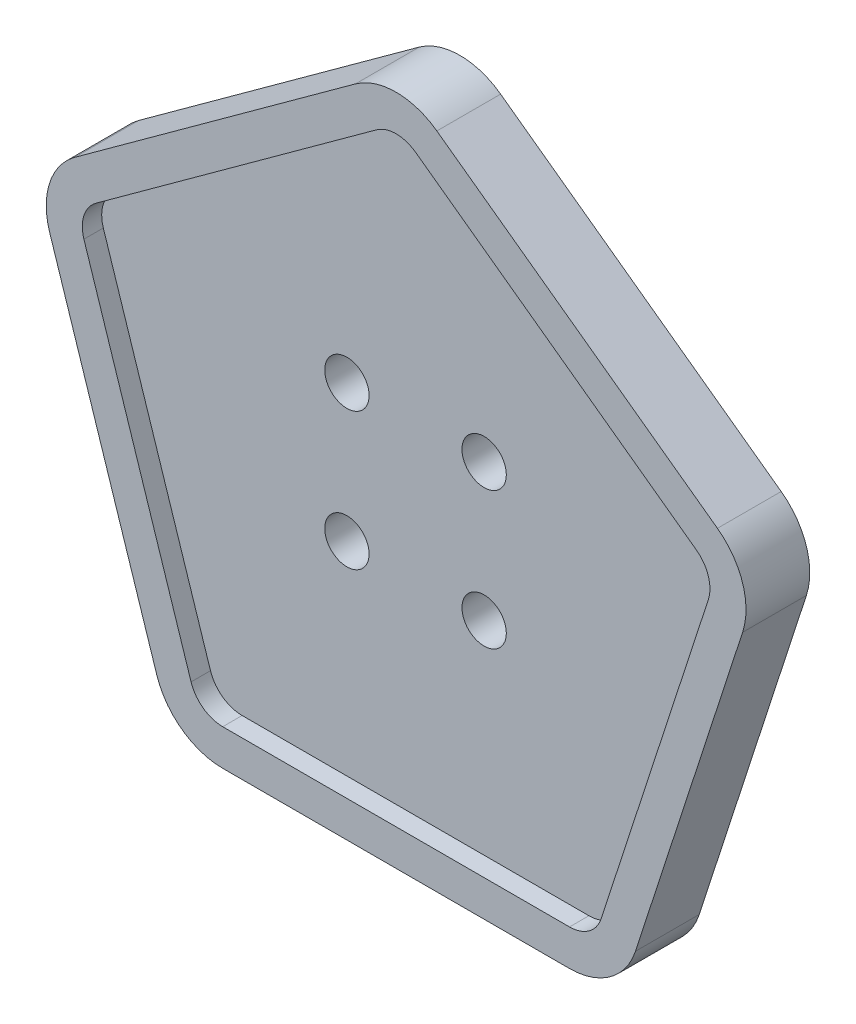
ISO-10303-21;
HEADER;
FILE_DESCRIPTION(('STEP AP214'),'2;1');
FILE_NAME('part.step','',(''),(''),'','','');
FILE_SCHEMA(('AUTOMOTIVE_DESIGN { 1 0 10303 214 1 1 1 1 }'));
ENDSEC;
DATA;
#1=APPLICATION_CONTEXT('core data for automotive mechanical design processes');
#2=APPLICATION_PROTOCOL_DEFINITION('international standard','automotive_design',2000,#1);
#3=PRODUCT_CONTEXT('',#1,'mechanical');
#4=PRODUCT('Part','Part','',(#3));
#5=PRODUCT_RELATED_PRODUCT_CATEGORY('part','',(#4));
#6=PRODUCT_DEFINITION_FORMATION('','',#4);
#7=PRODUCT_DEFINITION_CONTEXT('part definition',#1,'design');
#8=PRODUCT_DEFINITION('design','',#6,#7);
#9=PRODUCT_DEFINITION_SHAPE('','',#8);
#10=(LENGTH_UNIT() NAMED_UNIT(*) SI_UNIT(.MILLI.,.METRE.));
#11=(NAMED_UNIT(*) PLANE_ANGLE_UNIT() SI_UNIT($,.RADIAN.));
#12=(NAMED_UNIT(*) SI_UNIT($,.STERADIAN.) SOLID_ANGLE_UNIT());
#13=UNCERTAINTY_MEASURE_WITH_UNIT(LENGTH_MEASURE(1.E-05),#10,'distance_accuracy_value','');
#14=(GEOMETRIC_REPRESENTATION_CONTEXT(3) GLOBAL_UNCERTAINTY_ASSIGNED_CONTEXT((#13)) GLOBAL_UNIT_ASSIGNED_CONTEXT((#10,
#11,#12)) REPRESENTATION_CONTEXT('',''));
#15=CARTESIAN_POINT('',(0.,0.,0.));
#16=DIRECTION('',(0.,0.,1.));
#17=DIRECTION('',(1.,0.,0.));
#18=AXIS2_PLACEMENT_3D('',#15,#16,#17);
#19=CARTESIAN_POINT('',(-4.94974746830583,4.94974746830583,4.6));
#20=DIRECTION('',(0.,0.,-1.));
#21=DIRECTION('',(-1.,0.,0.));
#22=AXIS2_PLACEMENT_3D('',#19,#20,#21);
#23=CYLINDRICAL_SURFACE('',#22,1.6);
#24=CARTESIAN_POINT('',(-4.94974746830583,4.94974746830583,0.));
#25=DIRECTION('',(0.,0.,1.));
#26=DIRECTION('',(1.,0.,0.));
#27=AXIS2_PLACEMENT_3D('',#24,#25,#26);
#28=CIRCLE('',#27,1.6);
#29=CARTESIAN_POINT('',(-3.34974746830583,4.94974746830583,0.));
#30=VERTEX_POINT('',#29);
#31=EDGE_CURVE('E159',#30,#30,#28,.T.);
#32=ORIENTED_EDGE('',*,*,#31,.F.);
#33=EDGE_LOOP('',(#32));
#34=FACE_BOUND('',#33,.T.);
#35=CARTESIAN_POINT('',(-4.94974746830583,4.94974746830583,3.2));
#36=DIRECTION('',(0.,0.,1.));
#37=DIRECTION('',(1.,0.,0.));
#38=AXIS2_PLACEMENT_3D('',#35,#36,#37);
#39=CIRCLE('',#38,1.6);
#40=CARTESIAN_POINT('',(-3.34974746830583,4.94974746830583,3.2));
#41=VERTEX_POINT('',#40);
#42=EDGE_CURVE('E235',#41,#41,#39,.T.);
#43=ORIENTED_EDGE('',*,*,#42,.T.);
#44=EDGE_LOOP('',(#43));
#45=FACE_BOUND('',#44,.T.);
#46=ADVANCED_FACE('F33',(#34,#45),#23,.F.);
#47=CARTESIAN_POINT('',(4.94974746830583,4.94974746830583,4.6));
#48=DIRECTION('',(0.,0.,-1.));
#49=DIRECTION('',(-1.,0.,0.));
#50=AXIS2_PLACEMENT_3D('',#47,#48,#49);
#51=CYLINDRICAL_SURFACE('',#50,1.6);
#52=CARTESIAN_POINT('',(4.94974746830583,4.94974746830583,0.));
#53=DIRECTION('',(0.,0.,1.));
#54=DIRECTION('',(1.,0.,0.));
#55=AXIS2_PLACEMENT_3D('',#52,#53,#54);
#56=CIRCLE('',#55,1.6);
#57=CARTESIAN_POINT('',(6.54974746830583,4.94974746830583,0.));
#58=VERTEX_POINT('',#57);
#59=EDGE_CURVE('E226',#58,#58,#56,.T.);
#60=ORIENTED_EDGE('',*,*,#59,.F.);
#61=EDGE_LOOP('',(#60));
#62=FACE_BOUND('',#61,.T.);
#63=CARTESIAN_POINT('',(4.94974746830583,4.94974746830583,3.2));
#64=DIRECTION('',(0.,0.,1.));
#65=DIRECTION('',(1.,0.,0.));
#66=AXIS2_PLACEMENT_3D('',#63,#64,#65);
#67=CIRCLE('',#66,1.6);
#68=CARTESIAN_POINT('',(6.54974746830583,4.94974746830583,3.2));
#69=VERTEX_POINT('',#68);
#70=EDGE_CURVE('E238',#69,#69,#67,.T.);
#71=ORIENTED_EDGE('',*,*,#70,.T.);
#72=EDGE_LOOP('',(#71));
#73=FACE_BOUND('',#72,.T.);
#74=ADVANCED_FACE('F422',(#62,#73),#51,.F.);
#75=CARTESIAN_POINT('',(4.94974746830583,-4.94974746830583,4.6));
#76=DIRECTION('',(0.,0.,-1.));
#77=DIRECTION('',(-1.,0.,0.));
#78=AXIS2_PLACEMENT_3D('',#75,#76,#77);
#79=CYLINDRICAL_SURFACE('',#78,1.6);
#80=CARTESIAN_POINT('',(4.94974746830583,-4.94974746830583,0.));
#81=DIRECTION('',(0.,0.,1.));
#82=DIRECTION('',(1.,0.,0.));
#83=AXIS2_PLACEMENT_3D('',#80,#81,#82);
#84=CIRCLE('',#83,1.6);
#85=CARTESIAN_POINT('',(6.54974746830583,-4.94974746830583,0.));
#86=VERTEX_POINT('',#85);
#87=EDGE_CURVE('E229',#86,#86,#84,.T.);
#88=ORIENTED_EDGE('',*,*,#87,.F.);
#89=EDGE_LOOP('',(#88));
#90=FACE_BOUND('',#89,.T.);
#91=CARTESIAN_POINT('',(4.94974746830583,-4.94974746830583,3.2));
#92=DIRECTION('',(0.,0.,1.));
#93=DIRECTION('',(1.,0.,0.));
#94=AXIS2_PLACEMENT_3D('',#91,#92,#93);
#95=CIRCLE('',#94,1.6);
#96=CARTESIAN_POINT('',(6.54974746830583,-4.94974746830583,3.2));
#97=VERTEX_POINT('',#96);
#98=EDGE_CURVE('E241',#97,#97,#95,.T.);
#99=ORIENTED_EDGE('',*,*,#98,.T.);
#100=EDGE_LOOP('',(#99));
#101=FACE_BOUND('',#100,.T.);
#102=ADVANCED_FACE('F428',(#90,#101),#79,.F.);
#103=CARTESIAN_POINT('',(-4.94974746830583,-4.94974746830583,4.6));
#104=DIRECTION('',(0.,0.,-1.));
#105=DIRECTION('',(-1.,0.,0.));
#106=AXIS2_PLACEMENT_3D('',#103,#104,#105);
#107=CYLINDRICAL_SURFACE('',#106,1.6);
#108=CARTESIAN_POINT('',(-4.94974746830583,-4.94974746830583,0.));
#109=DIRECTION('',(0.,0.,1.));
#110=DIRECTION('',(1.,0.,0.));
#111=AXIS2_PLACEMENT_3D('',#108,#109,#110);
#112=CIRCLE('',#111,1.6);
#113=CARTESIAN_POINT('',(-3.34974746830583,-4.94974746830583,0.));
#114=VERTEX_POINT('',#113);
#115=EDGE_CURVE('E232',#114,#114,#112,.T.);
#116=ORIENTED_EDGE('',*,*,#115,.F.);
#117=EDGE_LOOP('',(#116));
#118=FACE_BOUND('',#117,.T.);
#119=CARTESIAN_POINT('',(-4.94974746830583,-4.94974746830583,3.2));
#120=DIRECTION('',(0.,0.,1.));
#121=DIRECTION('',(1.,0.,0.));
#122=AXIS2_PLACEMENT_3D('',#119,#120,#121);
#123=CIRCLE('',#122,1.6);
#124=CARTESIAN_POINT('',(-3.34974746830583,-4.94974746830583,3.2));
#125=VERTEX_POINT('',#124);
#126=EDGE_CURVE('E37',#125,#125,#123,.T.);
#127=ORIENTED_EDGE('',*,*,#126,.T.);
#128=EDGE_LOOP('',(#127));
#129=FACE_BOUND('',#128,.T.);
#130=ADVANCED_FACE('F437',(#118,#129),#107,.F.);
#131=CARTESIAN_POINT('',(-20.2406478165866,6.57658514012257,4.6));
#132=DIRECTION('',(0.,0.,1.));
#133=DIRECTION('',(1.,0.,0.));
#134=AXIS2_PLACEMENT_3D('',#131,#132,#133);
#135=PLANE('',#134);
#136=CARTESIAN_POINT('',(-20.2406478165866,6.57658514012257,4.6));
#137=DIRECTION('',(0.,0.,1.));
#138=DIRECTION('',(1.,0.,0.));
#139=AXIS2_PLACEMENT_3D('',#136,#137,#138);
#140=CIRCLE('',#139,2.4);
#141=CARTESIAN_POINT('',(-21.6513324220886,8.51822592662244,4.6));
#142=VERTEX_POINT('',#141);
#143=CARTESIAN_POINT('',(-22.523183455695,5.83494435362269,4.6));
#144=VERTEX_POINT('',#143);
#145=EDGE_CURVE('E49',#142,#144,#140,.T.);
#146=ORIENTED_EDGE('',*,*,#145,.F.);
#147=DIRECTION('',(-0.809016994374947,-0.587785252292473,0.));
#148=VECTOR('',#147,1.);
#149=CARTESIAN_POINT('',(-1.41068460550194,23.2239173597515,4.6));
#150=LINE('',#149,#148);
#151=CARTESIAN_POINT('',(-1.41068460550194,23.2239173597515,4.6));
#152=VERTEX_POINT('',#151);
#153=EDGE_CURVE('E273',#152,#142,#150,.T.);
#154=ORIENTED_EDGE('',*,*,#153,.F.);
#155=CARTESIAN_POINT('',(0.,21.2822765732516,4.6));
#156=DIRECTION('',(0.,0.,1.));
#157=DIRECTION('',(1.,0.,0.));
#158=AXIS2_PLACEMENT_3D('',#155,#156,#157);
#159=CIRCLE('',#158,2.4);
#160=CARTESIAN_POINT('',(1.41068460550193,23.2239173597515,4.6));
#161=VERTEX_POINT('',#160);
#162=EDGE_CURVE('E277',#161,#152,#159,.T.);
#163=ORIENTED_EDGE('',*,*,#162,.F.);
#164=DIRECTION('',(-0.809016994374948,0.587785252292473,0.));
#165=VECTOR('',#164,1.);
#166=CARTESIAN_POINT('',(21.6513324220886,8.51822592662244,4.6));
#167=LINE('',#166,#165);
#168=CARTESIAN_POINT('',(21.6513324220886,8.51822592662244,4.6));
#169=VERTEX_POINT('',#168);
#170=EDGE_CURVE('E280',#169,#161,#167,.T.);
#171=ORIENTED_EDGE('',*,*,#170,.F.);
#172=CARTESIAN_POINT('',(20.2406478165866,6.57658514012257,4.6));
#173=DIRECTION('',(0.,0.,1.));
#174=DIRECTION('',(1.,0.,0.));
#175=AXIS2_PLACEMENT_3D('',#172,#173,#174);
#176=CIRCLE('',#175,2.4);
#177=CARTESIAN_POINT('',(22.523183455695,5.8349443536227,4.6));
#178=VERTEX_POINT('',#177);
#179=EDGE_CURVE('E283',#178,#169,#176,.T.);
#180=ORIENTED_EDGE('',*,*,#179,.F.);
#181=DIRECTION('',(0.309016994374948,0.951056516295154,0.));
#182=VECTOR('',#181,1.);
#183=CARTESIAN_POINT('',(14.7919439440753,-17.9593642132483,4.6));
#184=LINE('',#183,#182);
#185=CARTESIAN_POINT('',(14.7919439440753,-17.9593642132483,4.6));
#186=VERTEX_POINT('',#185);
#187=EDGE_CURVE('E286',#186,#178,#184,.T.);
#188=ORIENTED_EDGE('',*,*,#187,.F.);
#189=CARTESIAN_POINT('',(12.5094083049669,-17.2177234267484,4.6));
#190=DIRECTION('',(0.,0.,1.));
#191=DIRECTION('',(1.,0.,0.));
#192=AXIS2_PLACEMENT_3D('',#189,#190,#191);
#193=CIRCLE('',#192,2.4);
#194=CARTESIAN_POINT('',(12.5094083049669,-19.6177234267484,4.6));
#195=VERTEX_POINT('',#194);
#196=EDGE_CURVE('E289',#195,#186,#193,.T.);
#197=ORIENTED_EDGE('',*,*,#196,.F.);
#198=DIRECTION('',(1.,0.,0.));
#199=VECTOR('',#198,1.);
#200=CARTESIAN_POINT('',(-12.5094083049669,-19.6177234267484,4.6));
#201=LINE('',#200,#199);
#202=CARTESIAN_POINT('',(-12.5094083049669,-19.6177234267484,4.6));
#203=VERTEX_POINT('',#202);
#204=EDGE_CURVE('E292',#203,#195,#201,.T.);
#205=ORIENTED_EDGE('',*,*,#204,.F.);
#206=CARTESIAN_POINT('',(-12.5094083049669,-17.2177234267484,4.6));
#207=DIRECTION('',(0.,0.,1.));
#208=DIRECTION('',(1.,0.,0.));
#209=AXIS2_PLACEMENT_3D('',#206,#207,#208);
#210=CIRCLE('',#209,2.4);
#211=CARTESIAN_POINT('',(-14.7919439440753,-17.9593642132483,4.6));
#212=VERTEX_POINT('',#211);
#213=EDGE_CURVE('E295',#212,#203,#210,.T.);
#214=ORIENTED_EDGE('',*,*,#213,.F.);
#215=DIRECTION('',(0.309016994374948,-0.951056516295153,0.));
#216=VECTOR('',#215,1.);
#217=CARTESIAN_POINT('',(-22.523183455695,5.83494435362269,4.6));
#218=LINE('',#217,#216);
#219=EDGE_CURVE('E298',#144,#212,#218,.T.);
#220=ORIENTED_EDGE('',*,*,#219,.F.);
#221=EDGE_LOOP('',(#146,#154,#163,#171,#180,#188,#197,#205,#214,#220));
#222=FACE_BOUND('',#221,.T.);
#223=CARTESIAN_POINT('',(-20.2406478165866,6.57658514012257,4.6));
#224=DIRECTION('',(0.,0.,1.));
#225=DIRECTION('',(1.,0.,0.));
#226=AXIS2_PLACEMENT_3D('',#223,#224,#225);
#227=CIRCLE('',#226,5.);
#228=CARTESIAN_POINT('',(-23.179574078049,10.6216701119973,4.6));
#229=VERTEX_POINT('',#228);
#230=CARTESIAN_POINT('',(-24.9959303980624,5.03150016824783,4.6));
#231=VERTEX_POINT('',#230);
#232=EDGE_CURVE('E175',#229,#231,#227,.T.);
#233=ORIENTED_EDGE('',*,*,#232,.T.);
#234=DIRECTION('',(0.309016994374948,-0.951056516295153,0.));
#235=VECTOR('',#234,1.);
#236=CARTESIAN_POINT('',(-24.9959303980624,5.03150016824783,4.6));
#237=LINE('',#236,#235);
#238=CARTESIAN_POINT('',(-17.2646908864427,-18.7628083986231,4.6));
#239=VERTEX_POINT('',#238);
#240=EDGE_CURVE('E105',#231,#239,#237,.T.);
#241=ORIENTED_EDGE('',*,*,#240,.T.);
#242=CARTESIAN_POINT('',(-12.5094083049669,-17.2177234267484,4.6));
#243=DIRECTION('',(0.,0.,1.));
#244=DIRECTION('',(1.,0.,0.));
#245=AXIS2_PLACEMENT_3D('',#242,#243,#244);
#246=CIRCLE('',#245,5.);
#247=CARTESIAN_POINT('',(-12.5094083049669,-22.2177234267484,4.6));
#248=VERTEX_POINT('',#247);
#249=EDGE_CURVE('E197',#239,#248,#246,.T.);
#250=ORIENTED_EDGE('',*,*,#249,.T.);
#251=DIRECTION('',(1.,0.,0.));
#252=VECTOR('',#251,1.);
#253=CARTESIAN_POINT('',(-12.5094083049669,-22.2177234267484,4.6));
#254=LINE('',#253,#252);
#255=CARTESIAN_POINT('',(12.5094083049669,-22.2177234267484,4.6));
#256=VERTEX_POINT('',#255);
#257=EDGE_CURVE('E216',#248,#256,#254,.T.);
#258=ORIENTED_EDGE('',*,*,#257,.T.);
#259=CARTESIAN_POINT('',(12.5094083049669,-17.2177234267484,4.6));
#260=DIRECTION('',(0.,0.,1.));
#261=DIRECTION('',(1.,0.,0.));
#262=AXIS2_PLACEMENT_3D('',#259,#260,#261);
#263=CIRCLE('',#262,5.);
#264=CARTESIAN_POINT('',(17.2646908864427,-18.7628083986231,4.6));
#265=VERTEX_POINT('',#264);
#266=EDGE_CURVE('E213',#256,#265,#263,.T.);
#267=ORIENTED_EDGE('',*,*,#266,.T.);
#268=DIRECTION('',(0.309016994374948,0.951056516295154,0.));
#269=VECTOR('',#268,1.);
#270=CARTESIAN_POINT('',(17.2646908864427,-18.7628083986231,4.6));
#271=LINE('',#270,#269);
#272=CARTESIAN_POINT('',(24.9959303980624,5.03150016824784,4.6));
#273=VERTEX_POINT('',#272);
#274=EDGE_CURVE('E215',#265,#273,#271,.T.);
#275=ORIENTED_EDGE('',*,*,#274,.T.);
#276=CARTESIAN_POINT('',(20.2406478165866,6.57658514012257,4.6));
#277=DIRECTION('',(0.,0.,1.));
#278=DIRECTION('',(1.,0.,0.));
#279=AXIS2_PLACEMENT_3D('',#276,#277,#278);
#280=CIRCLE('',#279,5.);
#281=CARTESIAN_POINT('',(23.179574078049,10.6216701119973,4.6));
#282=VERTEX_POINT('',#281);
#283=EDGE_CURVE('E134',#273,#282,#280,.T.);
#284=ORIENTED_EDGE('',*,*,#283,.T.);
#285=DIRECTION('',(-0.809016994374947,0.587785252292473,0.));
#286=VECTOR('',#285,1.);
#287=CARTESIAN_POINT('',(23.179574078049,10.6216701119973,4.6));
#288=LINE('',#287,#286);
#289=CARTESIAN_POINT('',(2.93892626146236,25.3273615451264,4.6));
#290=VERTEX_POINT('',#289);
#291=EDGE_CURVE('E127',#282,#290,#288,.T.);
#292=ORIENTED_EDGE('',*,*,#291,.T.);
#293=CARTESIAN_POINT('',(0.,21.2822765732516,4.6));
#294=DIRECTION('',(0.,0.,1.));
#295=DIRECTION('',(-1.,0.,0.));
#296=AXIS2_PLACEMENT_3D('',#293,#294,#295);
#297=CIRCLE('',#296,5.);
#298=CARTESIAN_POINT('',(-2.93892626146237,25.3273615451264,4.6));
#299=VERTEX_POINT('',#298);
#300=EDGE_CURVE('E131',#290,#299,#297,.T.);
#301=ORIENTED_EDGE('',*,*,#300,.T.);
#302=DIRECTION('',(-0.809016994374947,-0.587785252292473,0.));
#303=VECTOR('',#302,1.);
#304=CARTESIAN_POINT('',(-2.93892626146237,25.3273615451264,4.6));
#305=LINE('',#304,#303);
#306=EDGE_CURVE('E58',#299,#229,#305,.T.);
#307=ORIENTED_EDGE('',*,*,#306,.T.);
#308=EDGE_LOOP('',(#233,#241,#250,#258,#267,#275,#284,#292,#301,#307));
#309=FACE_BOUND('',#308,.T.);
#310=ADVANCED_FACE('F129',(#222,#309),#135,.T.);
#311=CARTESIAN_POINT('',(-20.2406478165866,6.57658514012257,0.));
#312=DIRECTION('',(0.,0.,1.));
#313=DIRECTION('',(1.,0.,0.));
#314=AXIS2_PLACEMENT_3D('',#311,#312,#313);
#315=PLANE('',#314);
#316=CARTESIAN_POINT('',(-20.2406478165866,6.57658514012257,0.));
#317=DIRECTION('',(0.,0.,1.));
#318=DIRECTION('',(1.,0.,0.));
#319=AXIS2_PLACEMENT_3D('',#316,#317,#318);
#320=CIRCLE('',#319,5.);
#321=CARTESIAN_POINT('',(-23.179574078049,10.6216701119973,0.));
#322=VERTEX_POINT('',#321);
#323=CARTESIAN_POINT('',(-24.9959303980624,5.03150016824783,0.));
#324=VERTEX_POINT('',#323);
#325=EDGE_CURVE('E155',#322,#324,#320,.T.);
#326=ORIENTED_EDGE('',*,*,#325,.F.);
#327=DIRECTION('',(-0.809016994374947,-0.587785252292473,0.));
#328=VECTOR('',#327,1.);
#329=CARTESIAN_POINT('',(-2.93892626146237,25.3273615451264,0.));
#330=LINE('',#329,#328);
#331=CARTESIAN_POINT('',(-2.93892626146237,25.3273615451264,0.));
#332=VERTEX_POINT('',#331);
#333=EDGE_CURVE('E97',#332,#322,#330,.T.);
#334=ORIENTED_EDGE('',*,*,#333,.F.);
#335=CARTESIAN_POINT('',(0.,21.2822765732516,0.));
#336=DIRECTION('',(0.,0.,1.));
#337=DIRECTION('',(-1.,0.,0.));
#338=AXIS2_PLACEMENT_3D('',#335,#336,#337);
#339=CIRCLE('',#338,5.);
#340=CARTESIAN_POINT('',(2.93892626146236,25.3273615451264,0.));
#341=VERTEX_POINT('',#340);
#342=EDGE_CURVE('E172',#341,#332,#339,.T.);
#343=ORIENTED_EDGE('',*,*,#342,.F.);
#344=DIRECTION('',(-0.809016994374947,0.587785252292473,0.));
#345=VECTOR('',#344,1.);
#346=CARTESIAN_POINT('',(23.179574078049,10.6216701119973,0.));
#347=LINE('',#346,#345);
#348=CARTESIAN_POINT('',(23.179574078049,10.6216701119973,0.));
#349=VERTEX_POINT('',#348);
#350=EDGE_CURVE('E143',#349,#341,#347,.T.);
#351=ORIENTED_EDGE('',*,*,#350,.F.);
#352=CARTESIAN_POINT('',(20.2406478165866,6.57658514012257,0.));
#353=DIRECTION('',(0.,0.,1.));
#354=DIRECTION('',(1.,0.,0.));
#355=AXIS2_PLACEMENT_3D('',#352,#353,#354);
#356=CIRCLE('',#355,5.);
#357=CARTESIAN_POINT('',(24.9959303980624,5.03150016824784,0.));
#358=VERTEX_POINT('',#357);
#359=EDGE_CURVE('E169',#358,#349,#356,.T.);
#360=ORIENTED_EDGE('',*,*,#359,.F.);
#361=DIRECTION('',(0.309016994374948,0.951056516295154,0.));
#362=VECTOR('',#361,1.);
#363=CARTESIAN_POINT('',(17.2646908864427,-18.7628083986231,0.));
#364=LINE('',#363,#362);
#365=CARTESIAN_POINT('',(17.2646908864427,-18.7628083986231,0.));
#366=VERTEX_POINT('',#365);
#367=EDGE_CURVE('E167',#366,#358,#364,.T.);
#368=ORIENTED_EDGE('',*,*,#367,.F.);
#369=CARTESIAN_POINT('',(12.5094083049669,-17.2177234267484,0.));
#370=DIRECTION('',(0.,0.,1.));
#371=DIRECTION('',(1.,0.,0.));
#372=AXIS2_PLACEMENT_3D('',#369,#370,#371);
#373=CIRCLE('',#372,5.);
#374=CARTESIAN_POINT('',(12.5094083049669,-22.2177234267484,0.));
#375=VERTEX_POINT('',#374);
#376=EDGE_CURVE('E165',#375,#366,#373,.T.);
#377=ORIENTED_EDGE('',*,*,#376,.F.);
#378=DIRECTION('',(1.,0.,0.));
#379=VECTOR('',#378,1.);
#380=CARTESIAN_POINT('',(-12.5094083049669,-22.2177234267484,0.));
#381=LINE('',#380,#379);
#382=CARTESIAN_POINT('',(-12.5094083049669,-22.2177234267484,0.));
#383=VERTEX_POINT('',#382);
#384=EDGE_CURVE('E163',#383,#375,#381,.T.);
#385=ORIENTED_EDGE('',*,*,#384,.F.);
#386=CARTESIAN_POINT('',(-12.5094083049669,-17.2177234267484,0.));
#387=DIRECTION('',(0.,0.,1.));
#388=DIRECTION('',(1.,0.,0.));
#389=AXIS2_PLACEMENT_3D('',#386,#387,#388);
#390=CIRCLE('',#389,5.);
#391=CARTESIAN_POINT('',(-17.2646908864427,-18.7628083986231,0.));
#392=VERTEX_POINT('',#391);
#393=EDGE_CURVE('E161',#392,#383,#390,.T.);
#394=ORIENTED_EDGE('',*,*,#393,.F.);
#395=DIRECTION('',(0.309016994374948,-0.951056516295153,0.));
#396=VECTOR('',#395,1.);
#397=CARTESIAN_POINT('',(-24.9959303980624,5.03150016824783,0.));
#398=LINE('',#397,#396);
#399=EDGE_CURVE('E158',#324,#392,#398,.T.);
#400=ORIENTED_EDGE('',*,*,#399,.F.);
#401=EDGE_LOOP('',(#326,#334,#343,#351,#360,#368,#377,#385,#394,#400));
#402=FACE_BOUND('',#401,.T.);
#403=ORIENTED_EDGE('',*,*,#31,.T.);
#404=EDGE_LOOP('',(#403));
#405=FACE_BOUND('',#404,.T.);
#406=ORIENTED_EDGE('',*,*,#59,.T.);
#407=EDGE_LOOP('',(#406));
#408=FACE_BOUND('',#407,.T.);
#409=ORIENTED_EDGE('',*,*,#87,.T.);
#410=EDGE_LOOP('',(#409));
#411=FACE_BOUND('',#410,.T.);
#412=ORIENTED_EDGE('',*,*,#115,.T.);
#413=EDGE_LOOP('',(#412));
#414=FACE_BOUND('',#413,.T.);
#415=ADVANCED_FACE('F201',(#402,#405,#408,#411,#414),#315,.F.);
#416=CARTESIAN_POINT('',(-20.2406478165866,6.57658514012257,4.6));
#417=DIRECTION('',(0.,0.,-1.));
#418=DIRECTION('',(-1.,0.,0.));
#419=AXIS2_PLACEMENT_3D('',#416,#417,#418);
#420=CYLINDRICAL_SURFACE('',#419,5.);
#421=ORIENTED_EDGE('',*,*,#325,.T.);
#422=DIRECTION('',(0.,0.,-1.));
#423=VECTOR('',#422,1.);
#424=CARTESIAN_POINT('',(-24.9959303980624,5.03150016824783,4.6));
#425=LINE('',#424,#423);
#426=EDGE_CURVE('E11',#231,#324,#425,.T.);
#427=ORIENTED_EDGE('',*,*,#426,.F.);
#428=ORIENTED_EDGE('',*,*,#232,.F.);
#429=DIRECTION('',(0.,0.,-1.));
#430=VECTOR('',#429,1.);
#431=CARTESIAN_POINT('',(-23.179574078049,10.6216701119973,4.6));
#432=LINE('',#431,#430);
#433=EDGE_CURVE('E151',#229,#322,#432,.T.);
#434=ORIENTED_EDGE('',*,*,#433,.T.);
#435=EDGE_LOOP('',(#421,#427,#428,#434));
#436=FACE_BOUND('',#435,.T.);
#437=ADVANCED_FACE('F35',(#436),#420,.T.);
#438=CARTESIAN_POINT('',(-24.9959303980624,5.03150016824783,4.6));
#439=DIRECTION('',(0.951056516295153,0.309016994374948,0.));
#440=DIRECTION('',(-0.309016994374948,0.951056516295153,0.));
#441=AXIS2_PLACEMENT_3D('',#438,#439,#440);
#442=PLANE('',#441);
#443=ORIENTED_EDGE('',*,*,#399,.T.);
#444=DIRECTION('',(0.,0.,-1.));
#445=VECTOR('',#444,1.);
#446=CARTESIAN_POINT('',(-17.2646908864427,-18.7628083986231,4.6));
#447=LINE('',#446,#445);
#448=EDGE_CURVE('E42',#239,#392,#447,.T.);
#449=ORIENTED_EDGE('',*,*,#448,.F.);
#450=ORIENTED_EDGE('',*,*,#240,.F.);
#451=ORIENTED_EDGE('',*,*,#426,.T.);
#452=EDGE_LOOP('',(#443,#449,#450,#451));
#453=FACE_BOUND('',#452,.T.);
#454=ADVANCED_FACE('F460',(#453),#442,.F.);
#455=CARTESIAN_POINT('',(-12.5094083049669,-17.2177234267484,4.6));
#456=DIRECTION('',(0.,0.,-1.));
#457=DIRECTION('',(-1.,0.,0.));
#458=AXIS2_PLACEMENT_3D('',#455,#456,#457);
#459=CYLINDRICAL_SURFACE('',#458,5.);
#460=ORIENTED_EDGE('',*,*,#393,.T.);
#461=DIRECTION('',(0.,0.,-1.));
#462=VECTOR('',#461,1.);
#463=CARTESIAN_POINT('',(-12.5094083049669,-22.2177234267484,4.6));
#464=LINE('',#463,#462);
#465=EDGE_CURVE('E188',#248,#383,#464,.T.);
#466=ORIENTED_EDGE('',*,*,#465,.F.);
#467=ORIENTED_EDGE('',*,*,#249,.F.);
#468=ORIENTED_EDGE('',*,*,#448,.T.);
#469=EDGE_LOOP('',(#460,#466,#467,#468));
#470=FACE_BOUND('',#469,.T.);
#471=ADVANCED_FACE('F195',(#470),#459,.T.);
#472=CARTESIAN_POINT('',(-12.5094083049669,-22.2177234267484,4.6));
#473=DIRECTION('',(0.,1.,0.));
#474=DIRECTION('',(0.,0.,1.));
#475=AXIS2_PLACEMENT_3D('',#472,#473,#474);
#476=PLANE('',#475);
#477=ORIENTED_EDGE('',*,*,#384,.T.);
#478=DIRECTION('',(0.,0.,-1.));
#479=VECTOR('',#478,1.);
#480=CARTESIAN_POINT('',(12.5094083049669,-22.2177234267484,4.6));
#481=LINE('',#480,#479);
#482=EDGE_CURVE('E185',#256,#375,#481,.T.);
#483=ORIENTED_EDGE('',*,*,#482,.F.);
#484=ORIENTED_EDGE('',*,*,#257,.F.);
#485=ORIENTED_EDGE('',*,*,#465,.T.);
#486=EDGE_LOOP('',(#477,#483,#484,#485));
#487=FACE_BOUND('',#486,.T.);
#488=ADVANCED_FACE('F207',(#487),#476,.F.);
#489=CARTESIAN_POINT('',(12.5094083049669,-17.2177234267484,4.6));
#490=DIRECTION('',(0.,0.,-1.));
#491=DIRECTION('',(-1.,0.,0.));
#492=AXIS2_PLACEMENT_3D('',#489,#490,#491);
#493=CYLINDRICAL_SURFACE('',#492,5.);
#494=ORIENTED_EDGE('',*,*,#376,.T.);
#495=DIRECTION('',(0.,0.,-1.));
#496=VECTOR('',#495,1.);
#497=CARTESIAN_POINT('',(17.2646908864427,-18.7628083986231,4.6));
#498=LINE('',#497,#496);
#499=EDGE_CURVE('E182',#265,#366,#498,.T.);
#500=ORIENTED_EDGE('',*,*,#499,.F.);
#501=ORIENTED_EDGE('',*,*,#266,.F.);
#502=ORIENTED_EDGE('',*,*,#482,.T.);
#503=EDGE_LOOP('',(#494,#500,#501,#502));
#504=FACE_BOUND('',#503,.T.);
#505=ADVANCED_FACE('F211',(#504),#493,.T.);
#506=CARTESIAN_POINT('',(17.2646908864427,-18.7628083986231,4.6));
#507=DIRECTION('',(-0.951056516295154,0.309016994374948,0.));
#508=DIRECTION('',(-0.309016994374948,-0.951056516295154,0.));
#509=AXIS2_PLACEMENT_3D('',#506,#507,#508);
#510=PLANE('',#509);
#511=ORIENTED_EDGE('',*,*,#367,.T.);
#512=DIRECTION('',(0.,0.,-1.));
#513=VECTOR('',#512,1.);
#514=CARTESIAN_POINT('',(24.9959303980624,5.03150016824784,4.6));
#515=LINE('',#514,#513);
#516=EDGE_CURVE('E179',#273,#358,#515,.T.);
#517=ORIENTED_EDGE('',*,*,#516,.F.);
#518=ORIENTED_EDGE('',*,*,#274,.F.);
#519=ORIENTED_EDGE('',*,*,#499,.T.);
#520=EDGE_LOOP('',(#511,#517,#518,#519));
#521=FACE_BOUND('',#520,.T.);
#522=ADVANCED_FACE('F450',(#521),#510,.F.);
#523=CARTESIAN_POINT('',(20.2406478165866,6.57658514012257,4.6));
#524=DIRECTION('',(0.,0.,-1.));
#525=DIRECTION('',(-1.,0.,0.));
#526=AXIS2_PLACEMENT_3D('',#523,#524,#525);
#527=CYLINDRICAL_SURFACE('',#526,5.);
#528=ORIENTED_EDGE('',*,*,#359,.T.);
#529=DIRECTION('',(0.,0.,-1.));
#530=VECTOR('',#529,1.);
#531=CARTESIAN_POINT('',(23.179574078049,10.6216701119973,4.6));
#532=LINE('',#531,#530);
#533=EDGE_CURVE('E146',#282,#349,#532,.T.);
#534=ORIENTED_EDGE('',*,*,#533,.F.);
#535=ORIENTED_EDGE('',*,*,#283,.F.);
#536=ORIENTED_EDGE('',*,*,#516,.T.);
#537=EDGE_LOOP('',(#528,#534,#535,#536));
#538=FACE_BOUND('',#537,.T.);
#539=ADVANCED_FACE('F447',(#538),#527,.T.);
#540=CARTESIAN_POINT('',(23.179574078049,10.6216701119973,4.6));
#541=DIRECTION('',(-0.587785252292473,-0.809016994374948,0.));
#542=DIRECTION('',(0.809016994374948,-0.587785252292473,0.));
#543=AXIS2_PLACEMENT_3D('',#540,#541,#542);
#544=PLANE('',#543);
#545=ORIENTED_EDGE('',*,*,#350,.T.);
#546=DIRECTION('',(0.,0.,-1.));
#547=VECTOR('',#546,1.);
#548=CARTESIAN_POINT('',(2.93892626146236,25.3273615451264,4.6));
#549=LINE('',#548,#547);
#550=EDGE_CURVE('E140',#290,#341,#549,.T.);
#551=ORIENTED_EDGE('',*,*,#550,.F.);
#552=ORIENTED_EDGE('',*,*,#291,.F.);
#553=ORIENTED_EDGE('',*,*,#533,.T.);
#554=EDGE_LOOP('',(#545,#551,#552,#553));
#555=FACE_BOUND('',#554,.T.);
#556=ADVANCED_FACE('F141',(#555),#544,.F.);
#557=CARTESIAN_POINT('',(0.,21.2822765732516,4.6));
#558=DIRECTION('',(0.,0.,-1.));
#559=DIRECTION('',(-1.,0.,0.));
#560=AXIS2_PLACEMENT_3D('',#557,#558,#559);
#561=CYLINDRICAL_SURFACE('',#560,5.);
#562=ORIENTED_EDGE('',*,*,#342,.T.);
#563=DIRECTION('',(0.,0.,-1.));
#564=VECTOR('',#563,1.);
#565=CARTESIAN_POINT('',(-2.93892626146237,25.3273615451264,4.6));
#566=LINE('',#565,#564);
#567=EDGE_CURVE('E147',#299,#332,#566,.T.);
#568=ORIENTED_EDGE('',*,*,#567,.F.);
#569=ORIENTED_EDGE('',*,*,#300,.F.);
#570=ORIENTED_EDGE('',*,*,#550,.T.);
#571=EDGE_LOOP('',(#562,#568,#569,#570));
#572=FACE_BOUND('',#571,.T.);
#573=ADVANCED_FACE('F149',(#572),#561,.T.);
#574=CARTESIAN_POINT('',(-2.93892626146237,25.3273615451264,4.6));
#575=DIRECTION('',(0.587785252292473,-0.809016994374947,0.));
#576=DIRECTION('',(0.809016994374947,0.587785252292473,0.));
#577=AXIS2_PLACEMENT_3D('',#574,#575,#576);
#578=PLANE('',#577);
#579=ORIENTED_EDGE('',*,*,#333,.T.);
#580=ORIENTED_EDGE('',*,*,#433,.F.);
#581=ORIENTED_EDGE('',*,*,#306,.F.);
#582=ORIENTED_EDGE('',*,*,#567,.T.);
#583=EDGE_LOOP('',(#579,#580,#581,#582));
#584=FACE_BOUND('',#583,.T.);
#585=ADVANCED_FACE('F440',(#584),#578,.F.);
#586=CARTESIAN_POINT('',(-20.2406478165866,6.57658514012257,3.2));
#587=DIRECTION('',(0.,0.,1.));
#588=DIRECTION('',(1.,0.,0.));
#589=AXIS2_PLACEMENT_3D('',#586,#587,#588);
#590=CYLINDRICAL_SURFACE('',#589,2.4);
#591=ORIENTED_EDGE('',*,*,#145,.T.);
#592=DIRECTION('',(0.,0.,1.));
#593=VECTOR('',#592,1.);
#594=CARTESIAN_POINT('',(-22.523183455695,5.83494435362269,3.2));
#595=LINE('',#594,#593);
#596=CARTESIAN_POINT('',(-22.523183455695,5.83494435362269,3.2));
#597=VERTEX_POINT('',#596);
#598=EDGE_CURVE('E244',#597,#144,#595,.T.);
#599=ORIENTED_EDGE('',*,*,#598,.F.);
#600=CARTESIAN_POINT('',(-20.2406478165866,6.57658514012257,3.2));
#601=DIRECTION('',(0.,0.,1.));
#602=DIRECTION('',(1.,0.,0.));
#603=AXIS2_PLACEMENT_3D('',#600,#601,#602);
#604=CIRCLE('',#603,2.4);
#605=CARTESIAN_POINT('',(-21.6513324220886,8.51822592662244,3.2));
#606=VERTEX_POINT('',#605);
#607=EDGE_CURVE('E276',#606,#597,#604,.T.);
#608=ORIENTED_EDGE('',*,*,#607,.F.);
#609=DIRECTION('',(0.,0.,1.));
#610=VECTOR('',#609,1.);
#611=CARTESIAN_POINT('',(-21.6513324220886,8.51822592662244,3.2));
#612=LINE('',#611,#610);
#613=EDGE_CURVE('E271',#606,#142,#612,.T.);
#614=ORIENTED_EDGE('',*,*,#613,.T.);
#615=EDGE_LOOP('',(#591,#599,#608,#614));
#616=FACE_BOUND('',#615,.T.);
#617=ADVANCED_FACE('F337',(#616),#590,.F.);
#618=CARTESIAN_POINT('',(-1.41068460550194,23.2239173597515,3.2));
#619=DIRECTION('',(-0.587785252292473,0.809016994374947,0.));
#620=DIRECTION('',(-0.809016994374947,-0.587785252292473,0.));
#621=AXIS2_PLACEMENT_3D('',#618,#619,#620);
#622=PLANE('',#621);
#623=ORIENTED_EDGE('',*,*,#153,.T.);
#624=ORIENTED_EDGE('',*,*,#613,.F.);
#625=DIRECTION('',(-0.809016994374947,-0.587785252292473,0.));
#626=VECTOR('',#625,1.);
#627=CARTESIAN_POINT('',(-1.41068460550194,23.2239173597515,3.2));
#628=LINE('',#627,#626);
#629=CARTESIAN_POINT('',(-1.41068460550194,23.2239173597515,3.2));
#630=VERTEX_POINT('',#629);
#631=EDGE_CURVE('E247',#630,#606,#628,.T.);
#632=ORIENTED_EDGE('',*,*,#631,.F.);
#633=DIRECTION('',(0.,0.,1.));
#634=VECTOR('',#633,1.);
#635=CARTESIAN_POINT('',(-1.41068460550194,23.2239173597515,3.2));
#636=LINE('',#635,#634);
#637=EDGE_CURVE('E268',#630,#152,#636,.T.);
#638=ORIENTED_EDGE('',*,*,#637,.T.);
#639=EDGE_LOOP('',(#623,#624,#632,#638));
#640=FACE_BOUND('',#639,.T.);
#641=ADVANCED_FACE('F361',(#640),#622,.F.);
#642=CARTESIAN_POINT('',(0.,21.2822765732516,3.2));
#643=DIRECTION('',(0.,0.,1.));
#644=DIRECTION('',(1.,0.,0.));
#645=AXIS2_PLACEMENT_3D('',#642,#643,#644);
#646=CYLINDRICAL_SURFACE('',#645,2.4);
#647=ORIENTED_EDGE('',*,*,#162,.T.);
#648=ORIENTED_EDGE('',*,*,#637,.F.);
#649=CARTESIAN_POINT('',(0.,21.2822765732516,3.2));
#650=DIRECTION('',(0.,0.,1.));
#651=DIRECTION('',(1.,0.,0.));
#652=AXIS2_PLACEMENT_3D('',#649,#650,#651);
#653=CIRCLE('',#652,2.4);
#654=CARTESIAN_POINT('',(1.41068460550193,23.2239173597515,3.2));
#655=VERTEX_POINT('',#654);
#656=EDGE_CURVE('E304',#655,#630,#653,.T.);
#657=ORIENTED_EDGE('',*,*,#656,.F.);
#658=DIRECTION('',(0.,0.,1.));
#659=VECTOR('',#658,1.);
#660=CARTESIAN_POINT('',(1.41068460550193,23.2239173597515,3.2));
#661=LINE('',#660,#659);
#662=EDGE_CURVE('E265',#655,#161,#661,.T.);
#663=ORIENTED_EDGE('',*,*,#662,.T.);
#664=EDGE_LOOP('',(#647,#648,#657,#663));
#665=FACE_BOUND('',#664,.T.);
#666=ADVANCED_FACE('F366',(#665),#646,.F.);
#667=CARTESIAN_POINT('',(21.6513324220886,8.51822592662244,3.2));
#668=DIRECTION('',(0.587785252292473,0.809016994374948,0.));
#669=DIRECTION('',(-0.809016994374948,0.587785252292473,0.));
#670=AXIS2_PLACEMENT_3D('',#667,#668,#669);
#671=PLANE('',#670);
#672=ORIENTED_EDGE('',*,*,#170,.T.);
#673=ORIENTED_EDGE('',*,*,#662,.F.);
#674=DIRECTION('',(-0.809016994374948,0.587785252292473,0.));
#675=VECTOR('',#674,1.);
#676=CARTESIAN_POINT('',(21.6513324220886,8.51822592662244,3.2));
#677=LINE('',#676,#675);
#678=CARTESIAN_POINT('',(21.6513324220886,8.51822592662244,3.2));
#679=VERTEX_POINT('',#678);
#680=EDGE_CURVE('E307',#679,#655,#677,.T.);
#681=ORIENTED_EDGE('',*,*,#680,.F.);
#682=DIRECTION('',(0.,0.,1.));
#683=VECTOR('',#682,1.);
#684=CARTESIAN_POINT('',(21.6513324220886,8.51822592662244,3.2));
#685=LINE('',#684,#683);
#686=EDGE_CURVE('E262',#679,#169,#685,.T.);
#687=ORIENTED_EDGE('',*,*,#686,.T.);
#688=EDGE_LOOP('',(#672,#673,#681,#687));
#689=FACE_BOUND('',#688,.T.);
#690=ADVANCED_FACE('F398',(#689),#671,.F.);
#691=CARTESIAN_POINT('',(20.2406478165866,6.57658514012257,3.2));
#692=DIRECTION('',(0.,0.,1.));
#693=DIRECTION('',(1.,0.,0.));
#694=AXIS2_PLACEMENT_3D('',#691,#692,#693);
#695=CYLINDRICAL_SURFACE('',#694,2.4);
#696=ORIENTED_EDGE('',*,*,#179,.T.);
#697=ORIENTED_EDGE('',*,*,#686,.F.);
#698=CARTESIAN_POINT('',(20.2406478165866,6.57658514012257,3.2));
#699=DIRECTION('',(0.,0.,1.));
#700=DIRECTION('',(1.,0.,0.));
#701=AXIS2_PLACEMENT_3D('',#698,#699,#700);
#702=CIRCLE('',#701,2.4);
#703=CARTESIAN_POINT('',(22.523183455695,5.8349443536227,3.2));
#704=VERTEX_POINT('',#703);
#705=EDGE_CURVE('E310',#704,#679,#702,.T.);
#706=ORIENTED_EDGE('',*,*,#705,.F.);
#707=DIRECTION('',(0.,0.,1.));
#708=VECTOR('',#707,1.);
#709=CARTESIAN_POINT('',(22.523183455695,5.8349443536227,3.2));
#710=LINE('',#709,#708);
#711=EDGE_CURVE('E259',#704,#178,#710,.T.);
#712=ORIENTED_EDGE('',*,*,#711,.T.);
#713=EDGE_LOOP('',(#696,#697,#706,#712));
#714=FACE_BOUND('',#713,.T.);
#715=ADVANCED_FACE('F402',(#714),#695,.F.);
#716=CARTESIAN_POINT('',(14.7919439440753,-17.9593642132483,3.2));
#717=DIRECTION('',(0.951056516295154,-0.309016994374948,0.));
#718=DIRECTION('',(0.309016994374948,0.951056516295154,0.));
#719=AXIS2_PLACEMENT_3D('',#716,#717,#718);
#720=PLANE('',#719);
#721=ORIENTED_EDGE('',*,*,#187,.T.);
#722=ORIENTED_EDGE('',*,*,#711,.F.);
#723=DIRECTION('',(0.309016994374948,0.951056516295154,0.));
#724=VECTOR('',#723,1.);
#725=CARTESIAN_POINT('',(14.7919439440753,-17.9593642132483,3.2));
#726=LINE('',#725,#724);
#727=CARTESIAN_POINT('',(14.7919439440753,-17.9593642132483,3.2));
#728=VERTEX_POINT('',#727);
#729=EDGE_CURVE('E313',#728,#704,#726,.T.);
#730=ORIENTED_EDGE('',*,*,#729,.F.);
#731=DIRECTION('',(0.,0.,1.));
#732=VECTOR('',#731,1.);
#733=CARTESIAN_POINT('',(14.7919439440753,-17.9593642132483,3.2));
#734=LINE('',#733,#732);
#735=EDGE_CURVE('E256',#728,#186,#734,.T.);
#736=ORIENTED_EDGE('',*,*,#735,.T.);
#737=EDGE_LOOP('',(#721,#722,#730,#736));
#738=FACE_BOUND('',#737,.T.);
#739=ADVANCED_FACE('F407',(#738),#720,.F.);
#740=CARTESIAN_POINT('',(12.5094083049669,-17.2177234267484,3.2));
#741=DIRECTION('',(0.,0.,1.));
#742=DIRECTION('',(1.,0.,0.));
#743=AXIS2_PLACEMENT_3D('',#740,#741,#742);
#744=CYLINDRICAL_SURFACE('',#743,2.4);
#745=ORIENTED_EDGE('',*,*,#196,.T.);
#746=ORIENTED_EDGE('',*,*,#735,.F.);
#747=CARTESIAN_POINT('',(12.5094083049669,-17.2177234267484,3.2));
#748=DIRECTION('',(0.,0.,1.));
#749=DIRECTION('',(1.,0.,0.));
#750=AXIS2_PLACEMENT_3D('',#747,#748,#749);
#751=CIRCLE('',#750,2.4);
#752=CARTESIAN_POINT('',(12.5094083049669,-19.6177234267484,3.2));
#753=VERTEX_POINT('',#752);
#754=EDGE_CURVE('E316',#753,#728,#751,.T.);
#755=ORIENTED_EDGE('',*,*,#754,.F.);
#756=DIRECTION('',(0.,0.,1.));
#757=VECTOR('',#756,1.);
#758=CARTESIAN_POINT('',(12.5094083049669,-19.6177234267484,3.2));
#759=LINE('',#758,#757);
#760=EDGE_CURVE('E253',#753,#195,#759,.T.);
#761=ORIENTED_EDGE('',*,*,#760,.T.);
#762=EDGE_LOOP('',(#745,#746,#755,#761));
#763=FACE_BOUND('',#762,.T.);
#764=ADVANCED_FACE('F410',(#763),#744,.F.);
#765=CARTESIAN_POINT('',(-12.5094083049669,-19.6177234267484,3.2));
#766=DIRECTION('',(0.,-1.,0.));
#767=DIRECTION('',(1.,0.,0.));
#768=AXIS2_PLACEMENT_3D('',#765,#766,#767);
#769=PLANE('',#768);
#770=ORIENTED_EDGE('',*,*,#204,.T.);
#771=ORIENTED_EDGE('',*,*,#760,.F.);
#772=DIRECTION('',(1.,0.,0.));
#773=VECTOR('',#772,1.);
#774=CARTESIAN_POINT('',(-12.5094083049669,-19.6177234267484,3.2));
#775=LINE('',#774,#773);
#776=CARTESIAN_POINT('',(-12.5094083049669,-19.6177234267484,3.2));
#777=VERTEX_POINT('',#776);
#778=EDGE_CURVE('E319',#777,#753,#775,.T.);
#779=ORIENTED_EDGE('',*,*,#778,.F.);
#780=DIRECTION('',(0.,0.,1.));
#781=VECTOR('',#780,1.);
#782=CARTESIAN_POINT('',(-12.5094083049669,-19.6177234267484,3.2));
#783=LINE('',#782,#781);
#784=EDGE_CURVE('E250',#777,#203,#783,.T.);
#785=ORIENTED_EDGE('',*,*,#784,.T.);
#786=EDGE_LOOP('',(#770,#771,#779,#785));
#787=FACE_BOUND('',#786,.T.);
#788=ADVANCED_FACE('F412',(#787),#769,.F.);
#789=CARTESIAN_POINT('',(-12.5094083049669,-17.2177234267484,3.2));
#790=DIRECTION('',(0.,0.,1.));
#791=DIRECTION('',(1.,0.,0.));
#792=AXIS2_PLACEMENT_3D('',#789,#790,#791);
#793=CYLINDRICAL_SURFACE('',#792,2.4);
#794=ORIENTED_EDGE('',*,*,#213,.T.);
#795=ORIENTED_EDGE('',*,*,#784,.F.);
#796=CARTESIAN_POINT('',(-12.5094083049669,-17.2177234267484,3.2));
#797=DIRECTION('',(0.,0.,1.));
#798=DIRECTION('',(1.,0.,0.));
#799=AXIS2_PLACEMENT_3D('',#796,#797,#798);
#800=CIRCLE('',#799,2.4);
#801=CARTESIAN_POINT('',(-14.7919439440753,-17.9593642132483,3.2));
#802=VERTEX_POINT('',#801);
#803=EDGE_CURVE('E322',#802,#777,#800,.T.);
#804=ORIENTED_EDGE('',*,*,#803,.F.);
#805=DIRECTION('',(0.,0.,1.));
#806=VECTOR('',#805,1.);
#807=CARTESIAN_POINT('',(-14.7919439440753,-17.9593642132483,3.2));
#808=LINE('',#807,#806);
#809=EDGE_CURVE('E246',#802,#212,#808,.T.);
#810=ORIENTED_EDGE('',*,*,#809,.T.);
#811=EDGE_LOOP('',(#794,#795,#804,#810));
#812=FACE_BOUND('',#811,.T.);
#813=ADVANCED_FACE('F381',(#812),#793,.F.);
#814=CARTESIAN_POINT('',(-22.523183455695,5.83494435362269,3.2));
#815=DIRECTION('',(-0.951056516295154,-0.309016994374948,0.));
#816=DIRECTION('',(0.309016994374948,-0.951056516295154,0.));
#817=AXIS2_PLACEMENT_3D('',#814,#815,#816);
#818=PLANE('',#817);
#819=ORIENTED_EDGE('',*,*,#219,.T.);
#820=ORIENTED_EDGE('',*,*,#809,.F.);
#821=DIRECTION('',(0.309016994374948,-0.951056516295153,0.));
#822=VECTOR('',#821,1.);
#823=CARTESIAN_POINT('',(-22.523183455695,5.83494435362269,3.2));
#824=LINE('',#823,#822);
#825=EDGE_CURVE('E325',#597,#802,#824,.T.);
#826=ORIENTED_EDGE('',*,*,#825,.F.);
#827=ORIENTED_EDGE('',*,*,#598,.T.);
#828=EDGE_LOOP('',(#819,#820,#826,#827));
#829=FACE_BOUND('',#828,.T.);
#830=ADVANCED_FACE('F375',(#829),#818,.F.);
#831=CARTESIAN_POINT('',(-20.2406478165866,6.57658514012257,3.2));
#832=DIRECTION('',(0.,0.,1.));
#833=DIRECTION('',(1.,0.,0.));
#834=AXIS2_PLACEMENT_3D('',#831,#832,#833);
#835=PLANE('',#834);
#836=ORIENTED_EDGE('',*,*,#42,.F.);
#837=EDGE_LOOP('',(#836));
#838=FACE_BOUND('',#837,.T.);
#839=ORIENTED_EDGE('',*,*,#70,.F.);
#840=EDGE_LOOP('',(#839));
#841=FACE_BOUND('',#840,.T.);
#842=ORIENTED_EDGE('',*,*,#98,.F.);
#843=EDGE_LOOP('',(#842));
#844=FACE_BOUND('',#843,.T.);
#845=ORIENTED_EDGE('',*,*,#126,.F.);
#846=EDGE_LOOP('',(#845));
#847=FACE_BOUND('',#846,.T.);
#848=ORIENTED_EDGE('',*,*,#607,.T.);
#849=ORIENTED_EDGE('',*,*,#825,.T.);
#850=ORIENTED_EDGE('',*,*,#803,.T.);
#851=ORIENTED_EDGE('',*,*,#778,.T.);
#852=ORIENTED_EDGE('',*,*,#754,.T.);
#853=ORIENTED_EDGE('',*,*,#729,.T.);
#854=ORIENTED_EDGE('',*,*,#705,.T.);
#855=ORIENTED_EDGE('',*,*,#680,.T.);
#856=ORIENTED_EDGE('',*,*,#656,.T.);
#857=ORIENTED_EDGE('',*,*,#631,.T.);
#858=EDGE_LOOP('',(#848,#849,#850,#851,#852,#853,#854,#855,#856,#857));
#859=FACE_BOUND('',#858,.T.);
#860=ADVANCED_FACE('F332',(#838,#841,#844,#847,#859),#835,.T.);
#861=CLOSED_SHELL('',(#46,#74,#102,#130,#310,#415,#437,#454,#471,#488,#505,#522,#539,#556,#573,
#585,#617,#641,#666,#690,#715,#739,#764,#788,#813,#830,#860));
#862=MANIFOLD_SOLID_BREP('B2',#861);
#863=ADVANCED_BREP_SHAPE_REPRESENTATION('',(#18,#862),#14);
#864=SHAPE_DEFINITION_REPRESENTATION(#9,#863);
ENDSEC;
END-ISO-10303-21;
